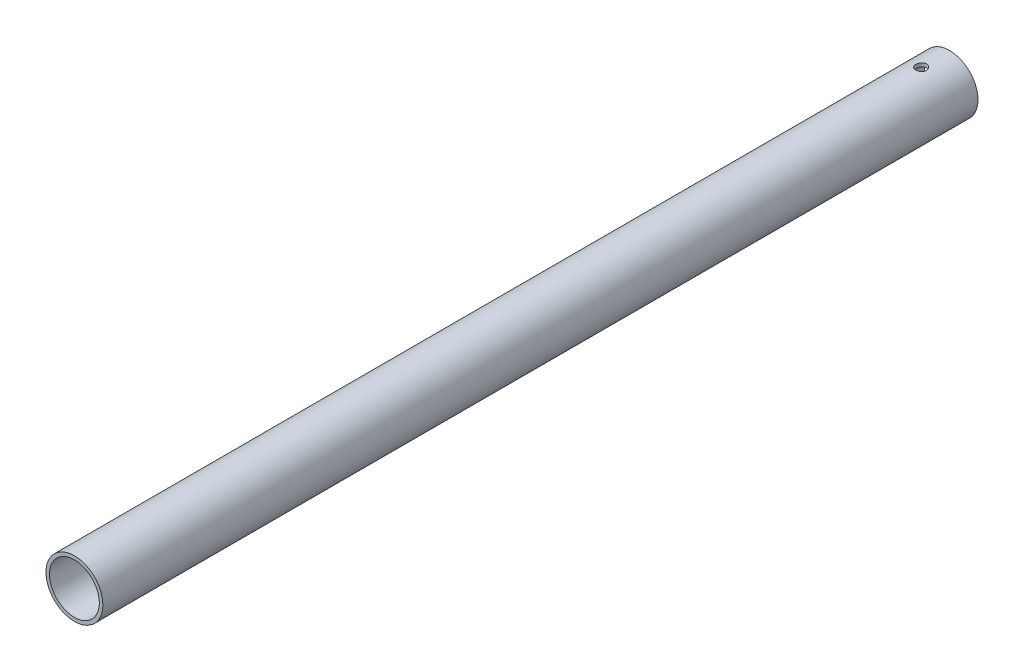
ISO-10303-21;
HEADER;
FILE_DESCRIPTION(('STEP AP214'),'2;1');
FILE_NAME('part.step','',(''),(''),'','','');
FILE_SCHEMA(('AUTOMOTIVE_DESIGN { 1 0 10303 214 1 1 1 1 }'));
ENDSEC;
DATA;
#1=APPLICATION_CONTEXT('core data for automotive mechanical design processes');
#2=APPLICATION_PROTOCOL_DEFINITION('international standard','automotive_design',2000,#1);
#3=PRODUCT_CONTEXT('',#1,'mechanical');
#4=PRODUCT('Part','Part','',(#3));
#5=PRODUCT_RELATED_PRODUCT_CATEGORY('part','',(#4));
#6=PRODUCT_DEFINITION_FORMATION('','',#4);
#7=PRODUCT_DEFINITION_CONTEXT('part definition',#1,'design');
#8=PRODUCT_DEFINITION('design','',#6,#7);
#9=PRODUCT_DEFINITION_SHAPE('','',#8);
#10=(LENGTH_UNIT() NAMED_UNIT(*) SI_UNIT(.MILLI.,.METRE.));
#11=(NAMED_UNIT(*) PLANE_ANGLE_UNIT() SI_UNIT($,.RADIAN.));
#12=(NAMED_UNIT(*) SI_UNIT($,.STERADIAN.) SOLID_ANGLE_UNIT());
#13=UNCERTAINTY_MEASURE_WITH_UNIT(LENGTH_MEASURE(1.E-05),#10,'distance_accuracy_value','');
#14=(GEOMETRIC_REPRESENTATION_CONTEXT(3) GLOBAL_UNCERTAINTY_ASSIGNED_CONTEXT((#13)) GLOBAL_UNIT_ASSIGNED_CONTEXT((#10,
#11,#12)) REPRESENTATION_CONTEXT('',''));
#15=CARTESIAN_POINT('',(0.,0.,0.));
#16=DIRECTION('',(0.,0.,1.));
#17=DIRECTION('',(1.,0.,0.));
#18=AXIS2_PLACEMENT_3D('',#15,#16,#17);
#19=CARTESIAN_POINT('',(0.,0.,0.));
#20=DIRECTION('',(0.,0.,-1.));
#21=DIRECTION('',(-1.,0.,0.));
#22=AXIS2_PLACEMENT_3D('',#19,#20,#21);
#23=CYLINDRICAL_SURFACE('',#22,7.);
#24=CARTESIAN_POINT('',(1.49999957417288,-6.83739682311729,7.99998630387781));
#25=CARTESIAN_POINT('',(1.49999584654102,-6.8373986294018,7.91677509765432));
#26=CARTESIAN_POINT('',(1.49305070514287,-6.83893295638273,7.83352848868597));
#27=CARTESIAN_POINT('',(1.46548266624783,-6.84489254243448,7.6693997826366));
#28=CARTESIAN_POINT('',(1.44484962540931,-6.84931994536659,7.58851948554113));
#29=CARTESIAN_POINT('',(1.39058333236031,-6.86054219671726,7.43152135615378));
#30=CARTESIAN_POINT('',(1.35696401573547,-6.86733450658376,7.3553985200134));
#31=CARTESIAN_POINT('',(1.27771882042309,-6.88251808732557,7.20987281130523));
#32=CARTESIAN_POINT('',(1.23209328985246,-6.89090931183883,7.14046974397937));
#33=CARTESIAN_POINT('',(1.12934210630725,-6.90849731391893,7.00922641450027));
#34=CARTESIAN_POINT('',(1.07205866093607,-6.91770404271772,6.94751100140676));
#35=CARTESIAN_POINT('',(0.94795842931807,-6.93579843704169,6.83448743069868));
#36=CARTESIAN_POINT('',(0.881140921778225,-6.94468607836278,6.78318006120947));
#37=CARTESIAN_POINT('',(0.739034763689646,-6.96124902501592,6.69193747940751));
#38=CARTESIAN_POINT('',(0.663667582984794,-6.96891122060693,6.65212198991911));
#39=CARTESIAN_POINT('',(0.507120727931794,-6.98204769749047,6.58576745265082));
#40=CARTESIAN_POINT('',(0.425941680117832,-6.98752221420287,6.55922697624664));
#41=CARTESIAN_POINT('',(0.261373063802914,-6.99559618208663,6.52056753621332));
#42=CARTESIAN_POINT('',(0.178035205643584,-6.9982376948781,6.50823738008607));
#43=CARTESIAN_POINT('',(0.0104347498853671,-7.00049364323439,6.49768862680542));
#44=CARTESIAN_POINT('',(-0.073827744979627,-7.00010841175912,6.49946847746737));
#45=CARTESIAN_POINT('',(-0.239430916347546,-6.99638653227692,6.51693120758853));
#46=CARTESIAN_POINT('',(-0.320796836869081,-6.9930981995856,6.53238650080752));
#47=CARTESIAN_POINT('',(-0.479752731700298,-6.98399450202545,6.57639915425769));
#48=CARTESIAN_POINT('',(-0.557342539671884,-6.97817902594756,6.60495709108473));
#49=CARTESIAN_POINT('',(-0.707179840305236,-6.96459629014251,6.67456804215275));
#50=CARTESIAN_POINT('',(-0.779385646385964,-6.95681551093244,6.71570804064621));
#51=CARTESIAN_POINT('',(-0.915952100603167,-6.94015645878392,6.80925056088464));
#52=CARTESIAN_POINT('',(-0.980311718528847,-6.93127804203236,6.86165455911119));
#53=CARTESIAN_POINT('',(-1.10071176359043,-6.91319171947776,6.97747895688683));
#54=CARTESIAN_POINT('',(-1.15656027296535,-6.90398077476945,7.04109855094509));
#55=CARTESIAN_POINT('',(-1.2568302904305,-6.88643422958296,7.17689527944929));
#56=CARTESIAN_POINT('',(-1.30125151347374,-6.87809865094335,7.24907262729782));
#57=CARTESIAN_POINT('',(-1.37748652856319,-6.8632390770395,7.40023771612619));
#58=CARTESIAN_POINT('',(-1.40926533962882,-6.85672012299779,7.4792436271751));
#59=CARTESIAN_POINT('',(-1.45903837524725,-6.84630267547417,7.64164670959056));
#60=CARTESIAN_POINT('',(-1.47703468963906,-6.84240378472324,7.72504321316152));
#61=CARTESIAN_POINT('',(-1.49843688231444,-6.83774858727099,7.89210998271576));
#62=CARTESIAN_POINT('',(-1.50212164592284,-6.83693222113433,7.97574288967764));
#63=CARTESIAN_POINT('',(-1.49555005583445,-6.83837268930477,8.14242803988799));
#64=CARTESIAN_POINT('',(-1.48529461836118,-6.84062932163824,8.22548032093767));
#65=CARTESIAN_POINT('',(-1.45137533480579,-6.84790492221502,8.38768395562371));
#66=CARTESIAN_POINT('',(-1.42786395407349,-6.85289246199611,8.46686873143925));
#67=CARTESIAN_POINT('',(-1.36826475562129,-6.8650397526771,8.62017507592188));
#68=CARTESIAN_POINT('',(-1.33217577423488,-6.87219970455837,8.69429617534374));
#69=CARTESIAN_POINT('',(-1.24782723515698,-6.88801775983144,8.8365813370783));
#70=CARTESIAN_POINT('',(-1.1993952131852,-6.89669649589487,8.90464082006917));
#71=CARTESIAN_POINT('',(-1.09196210622802,-6.91451929546442,9.03176864983593));
#72=CARTESIAN_POINT('',(-1.03295976407356,-6.92366341422758,9.09083592558644));
#73=CARTESIAN_POINT('',(-0.904801345503356,-6.94158389327703,9.19937891891406));
#74=CARTESIAN_POINT('',(-0.835483016694673,-6.95035079213225,9.24866488650745));
#75=CARTESIAN_POINT('',(-0.689388702074939,-6.96635737624989,9.3348920107581));
#76=CARTESIAN_POINT('',(-0.612613057010771,-6.97359713124414,9.37183373111844));
#77=CARTESIAN_POINT('',(-0.454251687477021,-6.98569367952629,9.432056408354));
#78=CARTESIAN_POINT('',(-0.372699271994239,-6.99056518156858,9.4554218664827));
#79=CARTESIAN_POINT('',(-0.206711018264262,-6.99743981263702,9.4880936704497));
#80=CARTESIAN_POINT('',(-0.122275583138579,-6.99944334101288,9.49740197368017));
#81=CARTESIAN_POINT('',(0.0452778837360165,-7.00034501828037,9.50161022330751));
#82=CARTESIAN_POINT('',(0.128388586791413,-6.99930433001139,9.4967939484783));
#83=CARTESIAN_POINT('',(0.292586718903017,-6.9943649454938,9.47352249796374));
#84=CARTESIAN_POINT('',(0.373674181470482,-6.99046629661458,9.4550675483332));
#85=CARTESIAN_POINT('',(0.531315023828663,-6.98025288883168,9.40517625087075));
#86=CARTESIAN_POINT('',(0.607881163275813,-6.97394534539835,9.37377864867051));
#87=CARTESIAN_POINT('',(0.754697084914331,-6.95958904185156,9.29893168316106));
#88=CARTESIAN_POINT('',(0.824946280288578,-6.95154012020756,9.25548120171921));
#89=CARTESIAN_POINT('',(0.958523166683128,-6.9343965942917,9.15682868626514));
#90=CARTESIAN_POINT('',(1.02170073777987,-6.9252855550198,9.1014262242236));
#91=CARTESIAN_POINT('',(1.13795931593519,-6.90713536311883,8.98084860220301));
#92=CARTESIAN_POINT('',(1.19103789695393,-6.8980962282615,8.91567110071305));
#93=CARTESIAN_POINT('',(1.28624004746504,-6.88098554561494,8.77639720173537));
#94=CARTESIAN_POINT('',(1.32821571529921,-6.87292776473047,8.70219792163806));
#95=CARTESIAN_POINT('',(1.39903528728356,-6.85886388821781,8.54764286280987));
#96=CARTESIAN_POINT('',(1.42789050497983,-6.85285602609893,8.4672924582198));
#97=CARTESIAN_POINT('',(1.46638916330032,-6.84470497442505,8.32235992294484));
#98=CARTESIAN_POINT('',(1.47897006185198,-6.8419823884001,8.25857438352018));
#99=CARTESIAN_POINT('',(1.4957765351595,-6.838327647867,8.12986181926324));
#100=CARTESIAN_POINT('',(1.50000248368788,-6.83739541326457,8.06493484562601));
#101=CARTESIAN_POINT('',(1.49999957417288,-6.83739682311729,7.99998630387781));
#102=B_SPLINE_CURVE_WITH_KNOTS('',3,(#24,#25,#26,#27,#28,#29,#30,#31,#32,#33,#34,#35,#36,#37,
#38,#39,#40,#41,#42,#43,#44,#45,#46,#47,#48,#49,#50,#51,#52,#53,#54,#55,#56,#57,#58,#59,#60,#61,
#62,#63,#64,#65,#66,#67,#68,#69,#70,#71,#72,#73,#74,#75,#76,#77,#78,#79,#80,#81,#82,#83,#84,#85,
#86,#87,#88,#89,#90,#91,#92,#93,#94,#95,#96,#97,#98,#99,#100,#101),.UNSPECIFIED.,.T.,.F.,(4,2,2,
2,2,2,2,2,2,2,2,2,2,2,2,2,2,2,2,2,2,2,2,2,2,2,2,2,2,2,2,2,2,2,2,2,2,2,4),(0.,0.249395606676751,
0.498976233331821,0.748289775487374,0.997596089660488,1.25053286591316,1.50348878808269,
1.75899202497759,2.01446775932261,2.26609557916242,2.51769571883026,2.76518587392296,
3.01268692112984,3.26193926474877,3.51122430023302,3.76549023255132,4.01976250677019,
4.27473352739442,4.52966587912192,4.77960474696596,5.02952718830406,5.27663208734501,
5.52375985434544,5.77455055906855,6.02537111112608,6.2806628177795,6.53594286488078,
6.78961649211551,7.04325479324263,7.29183234561637,7.54040577802335,7.78824041396745,
8.03609804895758,8.28848966756461,8.54094184085597,8.79660450583176,9.05204629711922,
9.2467148567406,9.4413747073448),.UNSPECIFIED.);
#103=CARTESIAN_POINT('',(1.49999957417288,-6.83739682311729,7.99998630387781));
#104=VERTEX_POINT('',#103);
#105=EDGE_CURVE('E59',#104,#104,#102,.F.);
#106=ORIENTED_EDGE('',*,*,#105,.T.);
#107=EDGE_LOOP('',(#106));
#108=FACE_BOUND('',#107,.T.);
#109=CARTESIAN_POINT('',(1.49999999993765,6.83739716560237,8.00001369612539));
#110=CARTESIAN_POINT('',(1.4999963225311,6.83739901228388,8.08322488764797));
#111=CARTESIAN_POINT('',(1.49305083594852,6.83893305829775,8.16647148189889));
#112=CARTESIAN_POINT('',(1.4654825442876,6.84489243851031,8.33060019357152));
#113=CARTESIAN_POINT('',(1.44484959307251,6.84931991749415,8.41148051046573));
#114=CARTESIAN_POINT('',(1.39058335842919,6.86054222584905,8.56847866586904));
#115=CARTESIAN_POINT('',(1.35696401192765,6.86733451654891,8.64460150866753));
#116=CARTESIAN_POINT('',(1.27771879239667,6.88251808346087,8.79012721847333));
#117=CARTESIAN_POINT('',(1.23209326939419,6.89090931305569,8.8595302813078));
#118=CARTESIAN_POINT('',(1.12934209312087,6.90849731849467,8.99077360319909));
#119=CARTESIAN_POINT('',(1.07205864717696,6.91770404547946,9.05248901306636));
#120=CARTESIAN_POINT('',(0.947958412810713,6.93579843869304,9.16551258239298));
#121=CARTESIAN_POINT('',(0.881140902369908,6.94468608069354,9.21681995293413));
#122=CARTESIAN_POINT('',(0.73903473921522,6.96124902779952,9.30806253460828));
#123=CARTESIAN_POINT('',(0.663667556532468,6.96891122318982,9.34787802320693));
#124=CARTESIAN_POINT('',(0.507120700019095,6.98204769947001,9.41423255726712));
#125=CARTESIAN_POINT('',(0.425941652887134,6.98752221584158,9.44077303172809));
#126=CARTESIAN_POINT('',(0.261373037526052,6.99559618307775,9.47943246840539));
#127=CARTESIAN_POINT('',(0.178035179604729,6.99823769553882,9.49176262299568));
#128=CARTESIAN_POINT('',(0.0104347238462271,7.00049364327481,9.50231137339101));
#129=CARTESIAN_POINT('',(-0.0738277712654445,7.00010841148255,9.50053152125442));
#130=CARTESIAN_POINT('',(-0.239430942661019,6.99638653137626,9.48306878816719));
#131=CARTESIAN_POINT('',(-0.32079686297147,6.99309819838474,9.46761349349022));
#132=CARTESIAN_POINT('',(-0.479752756936987,6.98399450028583,9.42360083722927));
#133=CARTESIAN_POINT('',(-0.557342564263348,6.97817902397568,9.39504289908202));
#134=CARTESIAN_POINT('',(-0.707179863577753,6.96459628777343,9.32543194543256));
#135=CARTESIAN_POINT('',(-0.779385668970108,6.95681550839471,9.28429194565116));
#136=CARTESIAN_POINT('',(-0.91595212165338,6.94015645599855,9.19074942292962));
#137=CARTESIAN_POINT('',(-0.980311738728611,6.93127803916733,9.13834542350094));
#138=CARTESIAN_POINT('',(-1.10071178185638,6.91319171656083,9.02252102345658));
#139=CARTESIAN_POINT('',(-1.15656029014779,6.90398077188244,8.95890142833831));
#140=CARTESIAN_POINT('',(-1.25683030526784,6.88643422686636,8.82310469790256));
#141=CARTESIAN_POINT('',(-1.30125152705111,6.87809864836711,8.75092734918371));
#142=CARTESIAN_POINT('',(-1.37748653942076,6.86323907485239,8.59976225893199));
#143=CARTESIAN_POINT('',(-1.40926534904395,6.85672012105714,8.52075634733986));
#144=CARTESIAN_POINT('',(-1.45903838170867,6.84630267409156,8.35835326409343));
#145=CARTESIAN_POINT('',(-1.47703469458898,6.84240378365225,8.2749567602346));
#146=CARTESIAN_POINT('',(-1.49843688424339,6.83774858684581,8.10788999042598));
#147=CARTESIAN_POINT('',(-1.50212164635047,6.83693222104115,8.02425708349337));
#148=CARTESIAN_POINT('',(-1.49555005330407,6.83837268985888,7.85757193359991));
#149=CARTESIAN_POINT('',(-1.48529461437395,6.84062932250767,7.77451965283788));
#150=CARTESIAN_POINT('',(-1.45137532798887,6.84790492366347,7.61231601885587));
#151=CARTESIAN_POINT('',(-1.42786394586532,6.85289246371243,7.53313124345787));
#152=CARTESIAN_POINT('',(-1.3682647447224,6.86503975485538,7.37982490003321));
#153=CARTESIAN_POINT('',(-1.33217576203683,6.87219970693068,7.30570380125168));
#154=CARTESIAN_POINT('',(-1.24782722042135,6.88801776250912,7.16341864093462));
#155=CARTESIAN_POINT('',(-1.1993951972013,6.89669649868391,7.09535915873092));
#156=CARTESIAN_POINT('',(-1.09196208786886,6.91451929837309,6.96823133072576));
#157=CARTESIAN_POINT('',(-1.03295974458574,6.92366341714461,6.90916405595115));
#158=CARTESIAN_POINT('',(-0.904801323926306,6.94158389609909,6.80062106480321));
#159=CARTESIAN_POINT('',(-0.835482994164278,6.95035079484933,6.75133509841174));
#160=CARTESIAN_POINT('',(-0.689388677896585,6.96635737865075,6.66510797675418));
#161=CARTESIAN_POINT('',(-0.612613032143508,6.97359713343493,6.62816625777556));
#162=CARTESIAN_POINT('',(-0.454251661678051,6.98569368120778,6.56794358347373));
#163=CARTESIAN_POINT('',(-0.372699245964091,6.99056518295713,6.54457812686303));
#164=CARTESIAN_POINT('',(-0.206710991793913,6.99743981342315,6.51190632587022));
#165=CARTESIAN_POINT('',(-0.122275556450519,6.99944334148097,6.50259802413794));
#166=CARTESIAN_POINT('',(0.0452779109019193,7.00034501810846,6.49838977749189));
#167=CARTESIAN_POINT('',(0.128388614224148,6.99930432950648,6.50320605385611));
#168=CARTESIAN_POINT('',(0.292586745755994,6.99436494436562,6.52647750739563));
#169=CARTESIAN_POINT('',(0.373674207497657,6.99046629522552,6.54493245837594));
#170=CARTESIAN_POINT('',(0.531315047250705,6.98025288701759,6.59482375806591));
#171=CARTESIAN_POINT('',(0.607881184958488,6.9739453434422,6.62622136102536));
#172=CARTESIAN_POINT('',(0.754697105637918,6.95958903966077,6.70106832876225));
#173=CARTESIAN_POINT('',(0.824946301593599,6.95154011786949,6.7445188120512));
#174=CARTESIAN_POINT('',(0.958523189781873,6.93439659092338,6.84317133279455));
#175=CARTESIAN_POINT('',(1.02170076184763,6.92528555073495,6.89857379857942));
#176=CARTESIAN_POINT('',(1.13795933870305,6.90713536009134,7.01915142357006));
#177=CARTESIAN_POINT('',(1.19103791829298,6.89809622740232,7.08432892347638));
#178=CARTESIAN_POINT('',(1.2862400546805,6.88098554130385,7.22360281593805));
#179=CARTESIAN_POINT('',(1.32821571017398,6.87292775465138,7.29780209076731));
#180=CARTESIAN_POINT('',(1.39903530356738,6.85886389607289,7.45235714915662));
#181=CARTESIAN_POINT('',(1.42789055287798,6.85285605795773,7.53270755957564));
#182=CARTESIAN_POINT('',(1.46638913913252,6.84470494753472,7.67764010993542));
#183=CARTESIAN_POINT('',(1.47896996438991,6.84198230279952,7.74142565752408));
#184=CARTESIAN_POINT('',(1.4957766422796,6.83832773136463,7.87013821369187));
#185=CARTESIAN_POINT('',(1.50000287025026,6.83739572421885,7.93506517085984));
#186=CARTESIAN_POINT('',(1.49999999993765,6.83739716560237,8.00001369612539));
#187=B_SPLINE_CURVE_WITH_KNOTS('',3,(#109,#110,#111,#112,#113,#114,#115,#116,#117,#118,#119,
#120,#121,#122,#123,#124,#125,#126,#127,#128,#129,#130,#131,#132,#133,#134,#135,#136,#137,#138,
#139,#140,#141,#142,#143,#144,#145,#146,#147,#148,#149,#150,#151,#152,#153,#154,#155,#156,#157,
#158,#159,#160,#161,#162,#163,#164,#165,#166,#167,#168,#169,#170,#171,#172,#173,#174,#175,#176,
#177,#178,#179,#180,#181,#182,#183,#184,#185,#186),.UNSPECIFIED.,.T.,.F.,(4,2,2,2,2,2,2,2,2,2,2,
2,2,2,2,2,2,2,2,2,2,2,2,2,2,2,2,2,2,2,2,2,2,2,2,2,2,2,4),(0.,0.249395599500219,
0.498976275906736,0.748289844574675,0.997596145583227,1.25053291241012,1.50348884441447,
1.75899208486927,2.01446781555242,2.26609563397224,2.51769577447154,2.7651859297909,
3.01268697660879,3.26193932039257,3.51122435619603,3.7654902887447,4.01976256315792,
4.27473358362235,4.52966593519451,4.77960480274669,5.02952724379567,5.27663214287424,
5.5237599099068,5.77455061490807,6.02537116728354,6.28066287414006,6.53594292124885,
6.78961654785457,7.04325484911056,7.29183240255397,7.54040583347549,7.7882404656613,
8.03609810468656,8.28848973405143,8.54094189714575,8.79660454159568,9.05204635340124,
9.24671492926629,9.44137475925879),.UNSPECIFIED.);
#188=CARTESIAN_POINT('',(1.49999999993765,6.83739716560237,8.00001369612539));
#189=VERTEX_POINT('',#188);
#190=EDGE_CURVE('E51',#189,#189,#187,.F.);
#191=ORIENTED_EDGE('',*,*,#190,.T.);
#192=EDGE_LOOP('',(#191));
#193=FACE_BOUND('',#192,.T.);
#194=CARTESIAN_POINT('',(0.,0.,0.));
#195=DIRECTION('',(0.,0.,-1.));
#196=DIRECTION('',(-1.,0.,0.));
#197=AXIS2_PLACEMENT_3D('',#194,#195,#196);
#198=CIRCLE('',#197,7.);
#199=CARTESIAN_POINT('',(-7.,0.,0.));
#200=VERTEX_POINT('',#199);
#201=EDGE_CURVE('E67',#200,#200,#198,.T.);
#202=ORIENTED_EDGE('',*,*,#201,.T.);
#203=EDGE_LOOP('',(#202));
#204=FACE_BOUND('',#203,.T.);
#205=CARTESIAN_POINT('',(0.,0.,246.));
#206=DIRECTION('',(0.,0.,-1.));
#207=DIRECTION('',(-1.,0.,0.));
#208=AXIS2_PLACEMENT_3D('',#205,#206,#207);
#209=CIRCLE('',#208,7.);
#210=CARTESIAN_POINT('',(-7.,0.,246.));
#211=VERTEX_POINT('',#210);
#212=EDGE_CURVE('E70',#211,#211,#209,.T.);
#213=ORIENTED_EDGE('',*,*,#212,.F.);
#214=EDGE_LOOP('',(#213));
#215=FACE_BOUND('',#214,.T.);
#216=ADVANCED_FACE('F15',(#108,#193,#204,#215),#23,.F.);
#217=CARTESIAN_POINT('',(0.,0.,246.));
#218=DIRECTION('',(0.,0.,1.));
#219=DIRECTION('',(1.,0.,0.));
#220=AXIS2_PLACEMENT_3D('',#217,#218,#219);
#221=PLANE('',#220);
#222=ORIENTED_EDGE('',*,*,#212,.T.);
#223=EDGE_LOOP('',(#222));
#224=FACE_BOUND('',#223,.T.);
#225=CARTESIAN_POINT('',(0.,0.,246.));
#226=DIRECTION('',(0.,0.,1.));
#227=DIRECTION('',(1.,0.,0.));
#228=AXIS2_PLACEMENT_3D('',#225,#226,#227);
#229=CIRCLE('',#228,8.);
#230=CARTESIAN_POINT('',(8.,0.,246.));
#231=VERTEX_POINT('',#230);
#232=EDGE_CURVE('E58',#231,#231,#229,.F.);
#233=ORIENTED_EDGE('',*,*,#232,.F.);
#234=EDGE_LOOP('',(#233));
#235=FACE_BOUND('',#234,.T.);
#236=ADVANCED_FACE('F75',(#224,#235),#221,.T.);
#237=CARTESIAN_POINT('',(0.,0.,0.));
#238=DIRECTION('',(0.,0.,1.));
#239=DIRECTION('',(1.,0.,0.));
#240=AXIS2_PLACEMENT_3D('',#237,#238,#239);
#241=PLANE('',#240);
#242=ORIENTED_EDGE('',*,*,#201,.F.);
#243=EDGE_LOOP('',(#242));
#244=FACE_BOUND('',#243,.T.);
#245=CARTESIAN_POINT('',(0.,0.,0.));
#246=DIRECTION('',(0.,0.,1.));
#247=DIRECTION('',(1.,0.,0.));
#248=AXIS2_PLACEMENT_3D('',#245,#246,#247);
#249=CIRCLE('',#248,8.);
#250=CARTESIAN_POINT('',(8.,0.,0.));
#251=VERTEX_POINT('',#250);
#252=EDGE_CURVE('E28',#251,#251,#249,.T.);
#253=ORIENTED_EDGE('',*,*,#252,.F.);
#254=EDGE_LOOP('',(#253));
#255=FACE_BOUND('',#254,.T.);
#256=ADVANCED_FACE('F84',(#244,#255),#241,.F.);
#257=CARTESIAN_POINT('',(0.,-8.,8.));
#258=DIRECTION('',(0.,1.,0.));
#259=DIRECTION('',(0.,0.,1.));
#260=AXIS2_PLACEMENT_3D('',#257,#258,#259);
#261=CYLINDRICAL_SURFACE('',#260,1.5);
#262=CARTESIAN_POINT('',(1.49999992546637,-7.85811676125394,8.00002137754044));
#263=CARTESIAN_POINT('',(1.49999552412115,-7.85811859457585,8.08347863472325));
#264=CARTESIAN_POINT('',(1.49300885269491,-7.85946123454017,8.16697732119664));
#265=CARTESIAN_POINT('',(1.46526779282627,-7.86467941849123,8.33162001582422));
#266=CARTESIAN_POINT('',(1.44450172554601,-7.86855711104098,8.41276196556309));
#267=CARTESIAN_POINT('',(1.38986211902149,-7.87839121574722,8.57028513672637));
#268=CARTESIAN_POINT('',(1.35600078976251,-7.88434569101128,8.64667071617634));
#269=CARTESIAN_POINT('',(1.2761641623873,-7.89766012785646,8.79267207288219));
#270=CARTESIAN_POINT('',(1.23018980923985,-7.90501997978812,8.8622883776472));
#271=CARTESIAN_POINT('',(1.12682228847733,-7.92041821757201,8.99364664791126));
#272=CARTESIAN_POINT('',(1.06930748866492,-7.92846325547113,9.05529213420145));
#273=CARTESIAN_POINT('',(0.944754593407532,-7.94426662732228,9.16811829341475));
#274=CARTESIAN_POINT('',(0.877715873403239,-7.95202494242954,9.21929827949429));
#275=CARTESIAN_POINT('',(0.735384506788565,-7.96645197391233,9.31011025928211));
#276=CARTESIAN_POINT('',(0.660032867059687,-7.97311193860658,9.34965130130202));
#277=CARTESIAN_POINT('',(0.503610335635262,-7.9845174122615,9.41547699537418));
#278=CARTESIAN_POINT('',(0.422539914775065,-7.98926307861343,9.44176273730541));
#279=CARTESIAN_POINT('',(0.257980896703852,-7.99625825846779,9.48003335431104));
#280=CARTESIAN_POINT('',(0.174531350374477,-7.9985361393623,9.4921808727483));
#281=CARTESIAN_POINT('',(0.00674967262995747,-8.00043686490335,9.50233698341852));
#282=CARTESIAN_POINT('',(-0.0775823830219046,-8.0000599356278,9.50034677958931));
#283=CARTESIAN_POINT('',(-0.243619919956004,-7.9967156792724,9.48240868429474));
#284=CARTESIAN_POINT('',(-0.325345068606089,-7.99378085184837,9.46663590241105));
#285=CARTESIAN_POINT('',(-0.484967773547691,-7.98568700847048,9.42185732034428));
#286=CARTESIAN_POINT('',(-0.562865190210455,-7.98052791144627,9.39285103782336));
#287=CARTESIAN_POINT('',(-0.713129219473473,-7.9685108844932,9.32226194160591));
#288=CARTESIAN_POINT('',(-0.785462158427322,-7.96164353673702,9.28060911508021));
#289=CARTESIAN_POINT('',(-0.922177260666647,-7.9469694643304,9.18596089500681));
#290=CARTESIAN_POINT('',(-0.986558614343034,-7.93916264418491,9.13296434797084));
#291=CARTESIAN_POINT('',(-1.10658052408786,-7.92333304883469,9.01616806951197));
#292=CARTESIAN_POINT('',(-1.16207190509118,-7.91530879781708,8.9522151384351));
#293=CARTESIAN_POINT('',(-1.26156376573736,-7.90006315922545,8.81583184484549));
#294=CARTESIAN_POINT('',(-1.3055640773156,-7.89284178339492,8.74340135836525));
#295=CARTESIAN_POINT('',(-1.3808672933496,-7.8800173905058,8.59192126469428));
#296=CARTESIAN_POINT('',(-1.41214852819107,-7.87441714001022,8.51286063572281));
#297=CARTESIAN_POINT('',(-1.46094174627101,-7.86551145860886,8.35047723279467));
#298=CARTESIAN_POINT('',(-1.478455289715,-7.8622057676801,8.26715494292525));
#299=CARTESIAN_POINT('',(-1.49899819305931,-7.85831492158564,8.09995863518222));
#300=CARTESIAN_POINT('',(-1.50224187574158,-7.85768951426254,8.01611185991827));
#301=CARTESIAN_POINT('',(-1.49472748531233,-7.85912233387652,7.84907475437832));
#302=CARTESIAN_POINT('',(-1.48397010456687,-7.86118042811187,7.76588439184673));
#303=CARTESIAN_POINT('',(-1.44894293314516,-7.86771086203137,7.60322610274882));
#304=CARTESIAN_POINT('',(-1.42478548577038,-7.87216312019347,7.52373310528132));
#305=CARTESIAN_POINT('',(-1.36376311719273,-7.88296292489943,7.36992305616514));
#306=CARTESIAN_POINT('',(-1.32689725937519,-7.88931061113245,7.29560638649918));
#307=CARTESIAN_POINT('',(-1.24101124058822,-7.90327771448643,7.15331436072732));
#308=CARTESIAN_POINT('',(-1.19185568593934,-7.91091096628168,7.08542211054759));
#309=CARTESIAN_POINT('',(-1.08296820687396,-7.92655020204903,6.95877210745437));
#310=CARTESIAN_POINT('',(-1.02323533154026,-7.9345562194856,6.90001517671264));
#311=CARTESIAN_POINT('',(-0.89393162218887,-7.95016824769335,6.79250306007891));
#312=CARTESIAN_POINT('',(-0.824239998240466,-7.95776748415553,6.74389200816555));
#313=CARTESIAN_POINT('',(-0.677554681657701,-7.97159574047177,6.65906876619606));
#314=CARTESIAN_POINT('',(-0.600561270342052,-7.97782481308397,6.62285609871033));
#315=CARTESIAN_POINT('',(-0.441856273106097,-7.98818176024235,6.5640733597964));
#316=CARTESIAN_POINT('',(-0.360171651513024,-7.99232052082464,6.54143249063597));
#317=CARTESIAN_POINT('',(-0.194074295611041,-7.99807695490354,6.5102100971008));
#318=CARTESIAN_POINT('',(-0.109661849309197,-7.99969489366965,6.50162709339291));
#319=CARTESIAN_POINT('',(0.0581127154120619,-8.00022211548849,6.49881555056035));
#320=CARTESIAN_POINT('',(0.141471134687059,-7.99917247792902,6.50436931412962));
#321=CARTESIAN_POINT('',(0.306044738936098,-7.99456784580711,6.5291968769241));
#322=CARTESIAN_POINT('',(0.387259944433508,-7.99101287524472,6.54847054471833));
#323=CARTESIAN_POINT('',(0.545126738544306,-7.98179699254909,6.60009909644142));
#324=CARTESIAN_POINT('',(0.62178613285391,-7.97613981041703,6.63243081994201));
#325=CARTESIAN_POINT('',(0.768624368628185,-7.9633319073179,6.70923160978075));
#326=CARTESIAN_POINT('',(0.838802775513539,-7.95618108630033,6.75370148924705));
#327=CARTESIAN_POINT('',(0.97177173706763,-7.94104574809091,6.85426562264747));
#328=CARTESIAN_POINT('',(1.03444216528675,-7.93305076265275,6.91051715403534));
#329=CARTESIAN_POINT('',(1.14952958052949,-7.91719426440432,7.03272145637825));
#330=CARTESIAN_POINT('',(1.20194415234794,-7.90933278343081,7.09867650607439));
#331=CARTESIAN_POINT('',(1.295487592724,-7.89455392187587,7.23914561348531));
#332=CARTESIAN_POINT('',(1.3365075610041,-7.88764594889808,7.31373321239856));
#333=CARTESIAN_POINT('',(1.40536918604426,-7.87566943645216,7.46884659548197));
#334=CARTESIAN_POINT('',(1.43322328247992,-7.87059916170939,7.54936669087687));
#335=CARTESIAN_POINT('',(1.46930180291453,-7.86392931894388,7.69177391607546));
#336=CARTESIAN_POINT('',(1.48079468484101,-7.86176244126335,7.75282738204001));
#337=CARTESIAN_POINT('',(1.49614527883755,-7.85885550014809,7.87592007228624));
#338=CARTESIAN_POINT('',(1.50000319848026,-7.85811539792346,7.9379592697225));
#339=CARTESIAN_POINT('',(1.49999992546637,-7.85811676125394,8.00002137754044));
#340=B_SPLINE_CURVE_WITH_KNOTS('',3,(#262,#263,#264,#265,#266,#267,#268,#269,#270,#271,#272,
#273,#274,#275,#276,#277,#278,#279,#280,#281,#282,#283,#284,#285,#286,#287,#288,#289,#290,#291,
#292,#293,#294,#295,#296,#297,#298,#299,#300,#301,#302,#303,#304,#305,#306,#307,#308,#309,#310,
#311,#312,#313,#314,#315,#316,#317,#318,#319,#320,#321,#322,#323,#324,#325,#326,#327,#328,#329,
#330,#331,#332,#333,#334,#335,#336,#337,#338,#339),.UNSPECIFIED.,.T.,.F.,(4,2,2,2,2,2,2,2,2,2,2,
2,2,2,2,2,2,2,2,2,2,2,2,2,2,2,2,2,2,2,2,2,2,2,2,2,2,2,4),(0.,0.25014464717658,0.500501577728708,
0.750625636803544,1.00073018881884,1.25362408187593,1.50653456686173,1.76137190665458,
2.01618828976137,2.2680433992545,2.51987706156905,2.76855691484254,3.01724583278413,
3.26733743482493,3.51745447956685,3.77140694947876,4.0253631334081,4.27975019008583,
4.53410841452744,4.78463303136577,5.03514525999144,5.28358831533813,5.53204968494824,
5.783379233109,6.03473138765983,6.28944211019271,6.5441430233733,6.79750344929764,
7.05083721195931,7.3002934724518,7.54974734328915,7.79876069963476,8.04779074133887,
8.30038534174759,8.5530393555738,8.80803088907553,9.06278101174061,9.24880349403903,
9.43482091885265),.UNSPECIFIED.);
#341=CARTESIAN_POINT('',(1.49999992546637,-7.85811676125394,8.00002137754044));
#342=VERTEX_POINT('',#341);
#343=EDGE_CURVE('E23',#342,#342,#340,.F.);
#344=ORIENTED_EDGE('',*,*,#343,.F.);
#345=EDGE_LOOP('',(#344));
#346=FACE_BOUND('',#345,.T.);
#347=ORIENTED_EDGE('',*,*,#105,.F.);
#348=EDGE_LOOP('',(#347));
#349=FACE_BOUND('',#348,.T.);
#350=ADVANCED_FACE('F45',(#346,#349),#261,.F.);
#351=CARTESIAN_POINT('',(0.,-8.,8.));
#352=DIRECTION('',(0.,1.,0.));
#353=DIRECTION('',(0.,0.,1.));
#354=AXIS2_PLACEMENT_3D('',#351,#352,#353);
#355=CYLINDRICAL_SURFACE('',#354,1.5);
#356=ORIENTED_EDGE('',*,*,#190,.F.);
#357=EDGE_LOOP('',(#356));
#358=FACE_BOUND('',#357,.T.);
#359=CARTESIAN_POINT('',(1.49999992546637,7.85811676125394,7.99997862245942));
#360=CARTESIAN_POINT('',(1.49999552412114,7.85811859457585,7.91652136527661));
#361=CARTESIAN_POINT('',(1.49300885269489,7.85946123454017,7.83302267880322));
#362=CARTESIAN_POINT('',(1.46526779282623,7.86467941849123,7.66837998417564));
#363=CARTESIAN_POINT('',(1.44450172554597,7.86855711104099,7.58723803443678));
#364=CARTESIAN_POINT('',(1.38986211902143,7.87839121574723,7.4297148632735));
#365=CARTESIAN_POINT('',(1.35600078976245,7.88434569101129,7.35332928382353));
#366=CARTESIAN_POINT('',(1.27616416238723,7.89766012785647,7.20732792711769));
#367=CARTESIAN_POINT('',(1.23018980923977,7.90501997978813,7.13771162235268));
#368=CARTESIAN_POINT('',(1.12682228847723,7.92041821757203,7.00635335208863));
#369=CARTESIAN_POINT('',(1.06930748866482,7.92846325547115,6.94470786579844));
#370=CARTESIAN_POINT('',(0.944754593407418,7.9442666273223,6.83188170658516));
#371=CARTESIAN_POINT('',(0.877715873403119,7.95202494242956,6.78070172050563));
#372=CARTESIAN_POINT('',(0.735384506788436,7.96645197391234,6.68988974071782));
#373=CARTESIAN_POINT('',(0.660032867059553,7.97311193860659,6.65034869869792));
#374=CARTESIAN_POINT('',(0.503610335635122,7.98451741226151,6.58452300462577));
#375=CARTESIAN_POINT('',(0.422539914774922,7.98926307861344,6.55823726269455));
#376=CARTESIAN_POINT('',(0.257980896703706,7.99625825846779,6.51996664568893));
#377=CARTESIAN_POINT('',(0.174531350374331,7.9985361393623,6.50781912725169));
#378=CARTESIAN_POINT('',(0.00674967262981091,8.00043686490335,6.49766301658148));
#379=CARTESIAN_POINT('',(-0.0775823830220505,8.0000599356278,6.4996532204107));
#380=CARTESIAN_POINT('',(-0.243619919956147,7.9967156792724,6.51759131570528));
#381=CARTESIAN_POINT('',(-0.325345068606231,7.99378085184837,6.53336409758899));
#382=CARTESIAN_POINT('',(-0.484967773547828,7.98568700847047,6.57814267965577));
#383=CARTESIAN_POINT('',(-0.562865190210589,7.98052791144626,6.6071489621767));
#384=CARTESIAN_POINT('',(-0.7131292194736,7.96851088449318,6.67773805839416));
#385=CARTESIAN_POINT('',(-0.785462158427446,7.961643536737,6.71939088491987));
#386=CARTESIAN_POINT('',(-0.922177260666762,7.94696946433038,6.81403910499328));
#387=CARTESIAN_POINT('',(-0.986558614343144,7.9391626441849,6.86703565202926));
#388=CARTESIAN_POINT('',(-1.10658052408796,7.92333304883468,6.98383193048814));
#389=CARTESIAN_POINT('',(-1.16207190509128,7.91530879781707,7.04778486156502));
#390=CARTESIAN_POINT('',(-1.26156376573744,7.90006315922544,7.18416815515464));
#391=CARTESIAN_POINT('',(-1.30556407731567,7.89284178339491,7.25659864163488));
#392=CARTESIAN_POINT('',(-1.38086729334966,7.88001739050579,7.40807873530586));
#393=CARTESIAN_POINT('',(-1.41214852819112,7.87441714001021,7.48713936427733));
#394=CARTESIAN_POINT('',(-1.46094174627104,7.86551145860885,7.64952276720548));
#395=CARTESIAN_POINT('',(-1.47845528971503,7.86220576768009,7.7328450570749));
#396=CARTESIAN_POINT('',(-1.49899819305932,7.85831492158564,7.90004136481793));
#397=CARTESIAN_POINT('',(-1.50224187574158,7.85768951426254,7.98388814008188));
#398=CARTESIAN_POINT('',(-1.49472748531232,7.85912233387652,8.15092524562183));
#399=CARTESIAN_POINT('',(-1.48397010456685,7.86118042811187,8.23411560815341));
#400=CARTESIAN_POINT('',(-1.44894293314512,7.86771086203138,8.39677389725132));
#401=CARTESIAN_POINT('',(-1.42478548577034,7.87216312019348,8.47626689471882));
#402=CARTESIAN_POINT('',(-1.36376311719267,7.88296292489944,8.63007694383499));
#403=CARTESIAN_POINT('',(-1.32689725937512,7.88931061113246,8.70439361350094));
#404=CARTESIAN_POINT('',(-1.24101124058814,7.90327771448645,8.8466856392728));
#405=CARTESIAN_POINT('',(-1.19185568593926,7.91091096628169,8.91457788945252));
#406=CARTESIAN_POINT('',(-1.08296820687386,7.92655020204905,9.04122789254574));
#407=CARTESIAN_POINT('',(-1.02323533154016,7.93455621948562,9.09998482328746));
#408=CARTESIAN_POINT('',(-0.893931622188753,7.95016824769336,9.20749693992118));
#409=CARTESIAN_POINT('',(-0.824239998240344,7.95776748415554,9.25610799183453));
#410=CARTESIAN_POINT('',(-0.677554681657571,7.97159574047178,9.340931233804));
#411=CARTESIAN_POINT('',(-0.600561270341918,7.97782481308398,9.37714390128973));
#412=CARTESIAN_POINT('',(-0.441856273105957,7.98818176024236,9.43592664020365));
#413=CARTESIAN_POINT('',(-0.360171651512882,7.99232052082465,9.45856750936406));
#414=CARTESIAN_POINT('',(-0.194074295610895,7.99807695490355,9.48978990289922));
#415=CARTESIAN_POINT('',(-0.109661849309051,7.99969489366966,9.4983729066071));
#416=CARTESIAN_POINT('',(0.0581127154122084,8.00022211548849,9.50118444943965));
#417=CARTESIAN_POINT('',(0.141471134687205,7.99917247792902,9.49563068587036));
#418=CARTESIAN_POINT('',(0.30604473893624,7.99456784580711,9.47080312307587));
#419=CARTESIAN_POINT('',(0.387259944433648,7.99101287524471,9.45152945528164));
#420=CARTESIAN_POINT('',(0.545126738544442,7.98179699254908,9.39990090355853));
#421=CARTESIAN_POINT('',(0.621786132854043,7.97613981041702,9.36756918005793));
#422=CARTESIAN_POINT('',(0.76862436862831,7.96333190731788,9.29076839021917));
#423=CARTESIAN_POINT('',(0.83880277551366,7.95618108630032,9.24629851075287));
#424=CARTESIAN_POINT('',(0.971771737067741,7.9410457480909,9.14573437735244));
#425=CARTESIAN_POINT('',(1.03444216528686,7.93305076265274,9.08948284596456));
#426=CARTESIAN_POINT('',(1.14952958052959,7.91719426440431,8.96727854362163));
#427=CARTESIAN_POINT('',(1.20194415234802,7.9093327834308,8.90132349392549));
#428=CARTESIAN_POINT('',(1.29548759272408,7.89455392187586,8.76085438651456));
#429=CARTESIAN_POINT('',(1.33650756100417,7.88764594889807,8.68626678760131));
#430=CARTESIAN_POINT('',(1.40536918604432,7.87566943645215,8.5311534045179));
#431=CARTESIAN_POINT('',(1.43322328247996,7.87059916170938,8.45063330912299));
#432=CARTESIAN_POINT('',(1.46930180291456,7.86392931894387,8.3082260839244));
#433=CARTESIAN_POINT('',(1.48079468484103,7.86176244126334,8.24717261795985));
#434=CARTESIAN_POINT('',(1.49614527883757,7.85885550014809,8.12407992771362));
#435=CARTESIAN_POINT('',(1.50000319848026,7.85811539792346,8.06204073027736));
#436=CARTESIAN_POINT('',(1.49999992546637,7.85811676125394,7.99997862245942));
#437=B_SPLINE_CURVE_WITH_KNOTS('',3,(#359,#360,#361,#362,#363,#364,#365,#366,#367,#368,#369,
#370,#371,#372,#373,#374,#375,#376,#377,#378,#379,#380,#381,#382,#383,#384,#385,#386,#387,#388,
#389,#390,#391,#392,#393,#394,#395,#396,#397,#398,#399,#400,#401,#402,#403,#404,#405,#406,#407,
#408,#409,#410,#411,#412,#413,#414,#415,#416,#417,#418,#419,#420,#421,#422,#423,#424,#425,#426,
#427,#428,#429,#430,#431,#432,#433,#434,#435,#436),.UNSPECIFIED.,.T.,.F.,(4,2,2,2,2,2,2,2,2,2,2,
2,2,2,2,2,2,2,2,2,2,2,2,2,2,2,2,2,2,2,2,2,2,2,2,2,2,2,4),(0.,0.250144647176583,
0.500501577728711,0.750625636803547,1.00073018881884,1.25362408187593,1.50653456686174,
1.76137190665459,2.01618828976138,2.26804339925451,2.51987706156906,2.76855691484254,
3.01724583278414,3.26733743482494,3.51745447956685,3.77140694947876,4.0253631334081,
4.27975019008583,4.53410841452744,4.78463303136577,5.03514525999144,5.28358831533813,
5.53204968494824,5.783379233109,6.03473138765983,6.28944211019272,6.54414302337331,
6.79750344929764,7.05083721195931,7.3002934724518,7.54974734328915,7.79876069963476,
8.04779074133888,8.30038534174759,8.55303935557381,8.80803088907553,9.06278101174061,
9.24880349403903,9.43482091885265),.UNSPECIFIED.);
#438=CARTESIAN_POINT('',(1.49999992546637,7.85811676125394,7.99997862245942));
#439=VERTEX_POINT('',#438);
#440=EDGE_CURVE('E10',#439,#439,#437,.F.);
#441=ORIENTED_EDGE('',*,*,#440,.F.);
#442=EDGE_LOOP('',(#441));
#443=FACE_BOUND('',#442,.T.);
#444=ADVANCED_FACE('F42',(#358,#443),#355,.F.);
#445=CARTESIAN_POINT('',(0.,0.,0.));
#446=DIRECTION('',(0.,0.,1.));
#447=DIRECTION('',(1.,0.,0.));
#448=AXIS2_PLACEMENT_3D('',#445,#446,#447);
#449=CYLINDRICAL_SURFACE('',#448,8.);
#450=ORIENTED_EDGE('',*,*,#440,.T.);
#451=EDGE_LOOP('',(#450));
#452=FACE_BOUND('',#451,.T.);
#453=ORIENTED_EDGE('',*,*,#343,.T.);
#454=EDGE_LOOP('',(#453));
#455=FACE_BOUND('',#454,.T.);
#456=ORIENTED_EDGE('',*,*,#252,.T.);
#457=EDGE_LOOP('',(#456));
#458=FACE_BOUND('',#457,.T.);
#459=ORIENTED_EDGE('',*,*,#232,.T.);
#460=EDGE_LOOP('',(#459));
#461=FACE_BOUND('',#460,.T.);
#462=ADVANCED_FACE('F40',(#452,#455,#458,#461),#449,.T.);
#463=CLOSED_SHELL('',(#216,#236,#256,#350,#444,#462));
#464=MANIFOLD_SOLID_BREP('B1',#463);
#465=ADVANCED_BREP_SHAPE_REPRESENTATION('',(#18,#464),#14);
#466=SHAPE_DEFINITION_REPRESENTATION(#9,#465);
ENDSEC;
END-ISO-10303-21;
